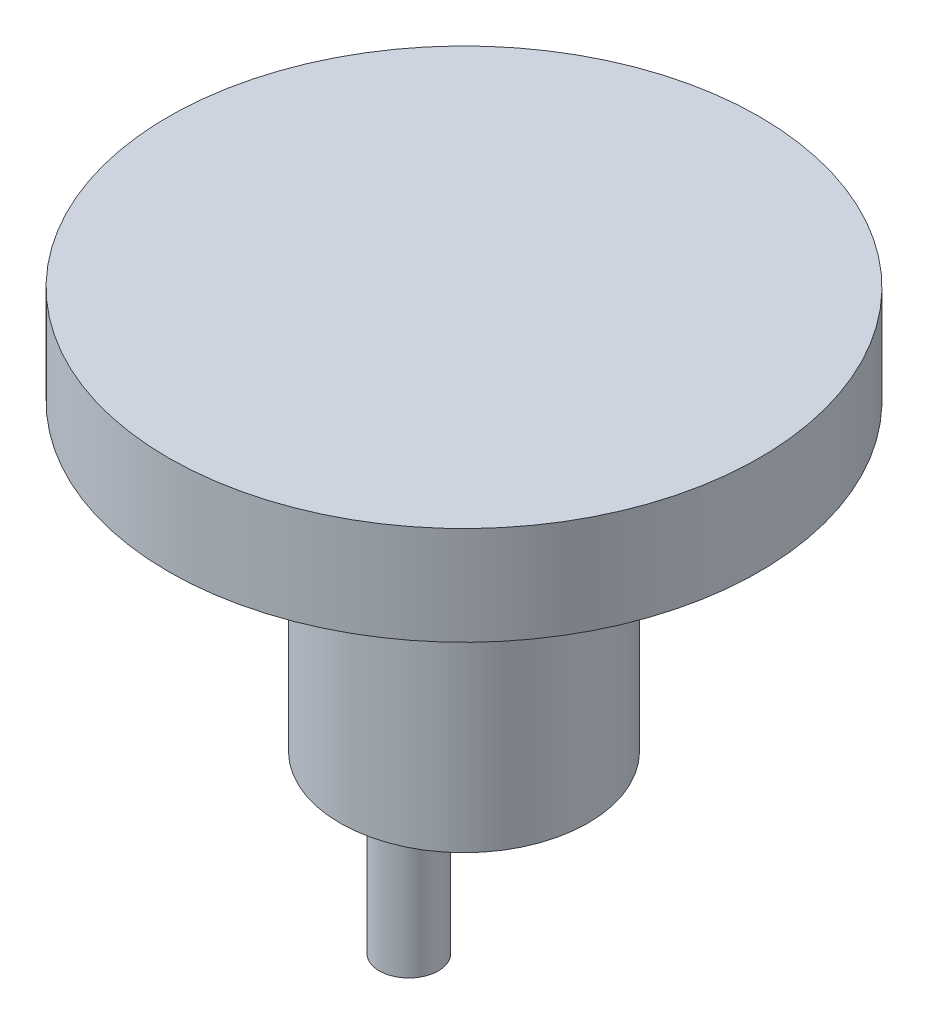
ISO-10303-21;
HEADER;
FILE_DESCRIPTION(('STEP AP214'),'2;1');
FILE_NAME('part.step','',(''),(''),'','','');
FILE_SCHEMA(('AUTOMOTIVE_DESIGN { 1 0 10303 214 1 1 1 1 }'));
ENDSEC;
DATA;
#1=APPLICATION_CONTEXT('core data for automotive mechanical design processes');
#2=APPLICATION_PROTOCOL_DEFINITION('international standard','automotive_design',2000,#1);
#3=PRODUCT_CONTEXT('',#1,'mechanical');
#4=PRODUCT('Part','Part','',(#3));
#5=PRODUCT_RELATED_PRODUCT_CATEGORY('part','',(#4));
#6=PRODUCT_DEFINITION_FORMATION('','',#4);
#7=PRODUCT_DEFINITION_CONTEXT('part definition',#1,'design');
#8=PRODUCT_DEFINITION('design','',#6,#7);
#9=PRODUCT_DEFINITION_SHAPE('','',#8);
#10=(LENGTH_UNIT() NAMED_UNIT(*) SI_UNIT(.MILLI.,.METRE.));
#11=(NAMED_UNIT(*) PLANE_ANGLE_UNIT() SI_UNIT($,.RADIAN.));
#12=(NAMED_UNIT(*) SI_UNIT($,.STERADIAN.) SOLID_ANGLE_UNIT());
#13=UNCERTAINTY_MEASURE_WITH_UNIT(LENGTH_MEASURE(1.E-05),#10,'distance_accuracy_value','');
#14=(GEOMETRIC_REPRESENTATION_CONTEXT(3) GLOBAL_UNCERTAINTY_ASSIGNED_CONTEXT((#13)) GLOBAL_UNIT_ASSIGNED_CONTEXT((#10,
#11,#12)) REPRESENTATION_CONTEXT('',''));
#15=CARTESIAN_POINT('',(0.,0.,0.));
#16=DIRECTION('',(0.,0.,1.));
#17=DIRECTION('',(1.,0.,0.));
#18=AXIS2_PLACEMENT_3D('',#15,#16,#17);
#19=CARTESIAN_POINT('',(0.,40.8,0.));
#20=DIRECTION('',(0.,-1.,0.));
#21=DIRECTION('',(0.,0.,-1.));
#22=AXIS2_PLACEMENT_3D('',#19,#20,#21);
#23=CYLINDRICAL_SURFACE('',#22,1.75);
#24=CARTESIAN_POINT('',(0.,29.3,0.));
#25=DIRECTION('',(0.,1.,0.));
#26=DIRECTION('',(0.,0.,1.));
#27=AXIS2_PLACEMENT_3D('',#24,#25,#26);
#28=CIRCLE('',#27,1.75);
#29=CARTESIAN_POINT('',(0.,29.3,1.75));
#30=VERTEX_POINT('',#29);
#31=EDGE_CURVE('E47',#30,#30,#28,.T.);
#32=ORIENTED_EDGE('',*,*,#31,.T.);
#33=EDGE_LOOP('',(#32));
#34=FACE_BOUND('',#33,.T.);
#35=CARTESIAN_POINT('',(0.,30.8,0.));
#36=DIRECTION('',(0.,1.,0.));
#37=DIRECTION('',(0.,0.,1.));
#38=AXIS2_PLACEMENT_3D('',#35,#36,#37);
#39=CIRCLE('',#38,1.75);
#40=CARTESIAN_POINT('',(0.,30.8,1.75));
#41=VERTEX_POINT('',#40);
#42=EDGE_CURVE('E41',#41,#41,#39,.T.);
#43=ORIENTED_EDGE('',*,*,#42,.F.);
#44=EDGE_LOOP('',(#43));
#45=FACE_BOUND('',#44,.T.);
#46=ADVANCED_FACE('F40',(#34,#45),#23,.T.);
#47=CARTESIAN_POINT('',(0.,29.3,0.));
#48=DIRECTION('',(0.,-1.,0.));
#49=DIRECTION('',(0.,0.,-1.));
#50=AXIS2_PLACEMENT_3D('',#47,#48,#49);
#51=CYLINDRICAL_SURFACE('',#50,12.6);
#52=CARTESIAN_POINT('',(0.,29.3,0.));
#53=DIRECTION('',(0.,1.,0.));
#54=DIRECTION('',(0.,0.,1.));
#55=AXIS2_PLACEMENT_3D('',#52,#53,#54);
#56=CIRCLE('',#55,12.6);
#57=CARTESIAN_POINT('',(0.,29.3,12.6));
#58=VERTEX_POINT('',#57);
#59=EDGE_CURVE('E65',#58,#58,#56,.T.);
#60=ORIENTED_EDGE('',*,*,#59,.F.);
#61=EDGE_LOOP('',(#60));
#62=FACE_BOUND('',#61,.T.);
#63=CARTESIAN_POINT('',(0.,0.,0.));
#64=DIRECTION('',(0.,1.,0.));
#65=DIRECTION('',(0.,0.,1.));
#66=AXIS2_PLACEMENT_3D('',#63,#64,#65);
#67=CIRCLE('',#66,12.6);
#68=CARTESIAN_POINT('',(0.,0.,12.6));
#69=VERTEX_POINT('',#68);
#70=EDGE_CURVE('E57',#69,#69,#67,.T.);
#71=ORIENTED_EDGE('',*,*,#70,.T.);
#72=EDGE_LOOP('',(#71));
#73=FACE_BOUND('',#72,.T.);
#74=ADVANCED_FACE('F39',(#62,#73),#51,.T.);
#75=CARTESIAN_POINT('',(0.,29.3,0.));
#76=DIRECTION('',(0.,1.,0.));
#77=DIRECTION('',(0.,0.,1.));
#78=AXIS2_PLACEMENT_3D('',#75,#76,#77);
#79=PLANE('',#78);
#80=ORIENTED_EDGE('',*,*,#31,.F.);
#81=EDGE_LOOP('',(#80));
#82=FACE_BOUND('',#81,.T.);
#83=ORIENTED_EDGE('',*,*,#59,.T.);
#84=EDGE_LOOP('',(#83));
#85=FACE_BOUND('',#84,.T.);
#86=ADVANCED_FACE('F72',(#82,#85),#79,.T.);
#87=CARTESIAN_POINT('',(0.,0.,0.));
#88=DIRECTION('',(0.,1.,0.));
#89=DIRECTION('',(0.,0.,1.));
#90=AXIS2_PLACEMENT_3D('',#87,#88,#89);
#91=PLANE('',#90);
#92=CARTESIAN_POINT('',(0.,0.,5.6));
#93=DIRECTION('',(0.,-1.,0.));
#94=DIRECTION('',(0.,0.,-1.));
#95=AXIS2_PLACEMENT_3D('',#92,#93,#94);
#96=CIRCLE('',#95,3.);
#97=CARTESIAN_POINT('',(0.,0.,2.6));
#98=VERTEX_POINT('',#97);
#99=EDGE_CURVE('E10',#98,#98,#96,.T.);
#100=ORIENTED_EDGE('',*,*,#99,.F.);
#101=EDGE_LOOP('',(#100));
#102=FACE_BOUND('',#101,.T.);
#103=ORIENTED_EDGE('',*,*,#70,.F.);
#104=EDGE_LOOP('',(#103));
#105=FACE_BOUND('',#104,.T.);
#106=ADVANCED_FACE('F67',(#102,#105),#91,.F.);
#107=CARTESIAN_POINT('',(0.,30.8,0.));
#108=DIRECTION('',(0.,1.,0.));
#109=DIRECTION('',(0.,0.,1.));
#110=AXIS2_PLACEMENT_3D('',#107,#108,#109);
#111=CYLINDRICAL_SURFACE('',#110,30.);
#112=CARTESIAN_POINT('',(0.,30.8,0.));
#113=DIRECTION('',(0.,1.,0.));
#114=DIRECTION('',(0.,0.,1.));
#115=AXIS2_PLACEMENT_3D('',#112,#113,#114);
#116=CIRCLE('',#115,30.);
#117=CARTESIAN_POINT('',(0.,30.8,30.));
#118=VERTEX_POINT('',#117);
#119=EDGE_CURVE('E52',#118,#118,#116,.T.);
#120=ORIENTED_EDGE('',*,*,#119,.T.);
#121=EDGE_LOOP('',(#120));
#122=FACE_BOUND('',#121,.T.);
#123=CARTESIAN_POINT('',(0.,40.8,0.));
#124=DIRECTION('',(0.,1.,0.));
#125=DIRECTION('',(0.,0.,1.));
#126=AXIS2_PLACEMENT_3D('',#123,#124,#125);
#127=CIRCLE('',#126,30.);
#128=CARTESIAN_POINT('',(0.,40.8,30.));
#129=VERTEX_POINT('',#128);
#130=EDGE_CURVE('E60',#129,#129,#127,.T.);
#131=ORIENTED_EDGE('',*,*,#130,.F.);
#132=EDGE_LOOP('',(#131));
#133=FACE_BOUND('',#132,.T.);
#134=ADVANCED_FACE('F66',(#122,#133),#111,.T.);
#135=CARTESIAN_POINT('',(0.,30.8,0.));
#136=DIRECTION('',(0.,1.,0.));
#137=DIRECTION('',(0.,0.,1.));
#138=AXIS2_PLACEMENT_3D('',#135,#136,#137);
#139=PLANE('',#138);
#140=ORIENTED_EDGE('',*,*,#42,.T.);
#141=EDGE_LOOP('',(#140));
#142=FACE_BOUND('',#141,.T.);
#143=ORIENTED_EDGE('',*,*,#119,.F.);
#144=EDGE_LOOP('',(#143));
#145=FACE_BOUND('',#144,.T.);
#146=ADVANCED_FACE('F79',(#142,#145),#139,.F.);
#147=CARTESIAN_POINT('',(0.,40.8,0.));
#148=DIRECTION('',(0.,1.,0.));
#149=DIRECTION('',(0.,0.,1.));
#150=AXIS2_PLACEMENT_3D('',#147,#148,#149);
#151=PLANE('',#150);
#152=ORIENTED_EDGE('',*,*,#130,.T.);
#153=EDGE_LOOP('',(#152));
#154=FACE_BOUND('',#153,.T.);
#155=ADVANCED_FACE('F91',(#154),#151,.T.);
#156=CARTESIAN_POINT('',(0.,-15.,5.6));
#157=DIRECTION('',(0.,1.,0.));
#158=DIRECTION('',(0.,0.,1.));
#159=AXIS2_PLACEMENT_3D('',#156,#157,#158);
#160=CYLINDRICAL_SURFACE('',#159,3.);
#161=CARTESIAN_POINT('',(0.,-15.,5.6));
#162=DIRECTION('',(0.,-1.,0.));
#163=DIRECTION('',(0.,0.,-1.));
#164=AXIS2_PLACEMENT_3D('',#161,#162,#163);
#165=CIRCLE('',#164,3.);
#166=CARTESIAN_POINT('',(0.,-15.,2.6));
#167=VERTEX_POINT('',#166);
#168=EDGE_CURVE('E55',#167,#167,#165,.T.);
#169=ORIENTED_EDGE('',*,*,#168,.F.);
#170=EDGE_LOOP('',(#169));
#171=FACE_BOUND('',#170,.T.);
#172=ORIENTED_EDGE('',*,*,#99,.T.);
#173=EDGE_LOOP('',(#172));
#174=FACE_BOUND('',#173,.T.);
#175=ADVANCED_FACE('F94',(#171,#174),#160,.T.);
#176=CARTESIAN_POINT('',(0.,-15.,5.6));
#177=DIRECTION('',(0.,-1.,0.));
#178=DIRECTION('',(0.,0.,-1.));
#179=AXIS2_PLACEMENT_3D('',#176,#177,#178);
#180=PLANE('',#179);
#181=ORIENTED_EDGE('',*,*,#168,.T.);
#182=EDGE_LOOP('',(#181));
#183=FACE_BOUND('',#182,.T.);
#184=ADVANCED_FACE('F101',(#183),#180,.T.);
#185=CLOSED_SHELL('',(#46,#74,#86,#106,#134,#146,#155,#175,#184));
#186=MANIFOLD_SOLID_BREP('B2',#185);
#187=ADVANCED_BREP_SHAPE_REPRESENTATION('',(#18,#186),#14);
#188=SHAPE_DEFINITION_REPRESENTATION(#9,#187);
ENDSEC;
END-ISO-10303-21;
